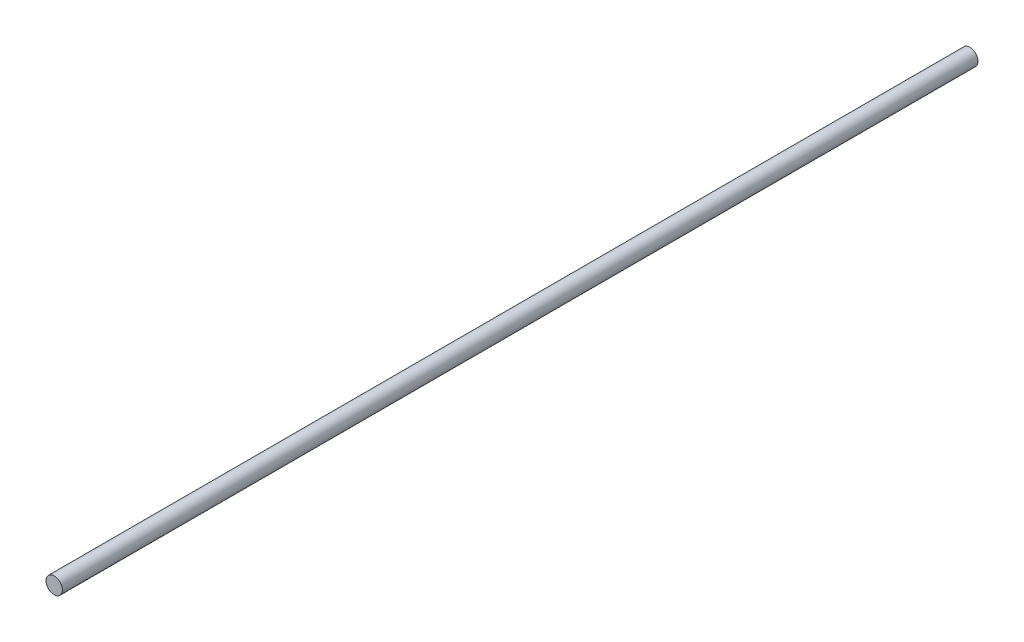
ISO-10303-21;
HEADER;
FILE_DESCRIPTION(('STEP AP214'),'2;1');
FILE_NAME('part.step','',(''),(''),'','','');
FILE_SCHEMA(('AUTOMOTIVE_DESIGN { 1 0 10303 214 1 1 1 1 }'));
ENDSEC;
DATA;
#1=APPLICATION_CONTEXT('core data for automotive mechanical design processes');
#2=APPLICATION_PROTOCOL_DEFINITION('international standard','automotive_design',2000,#1);
#3=PRODUCT_CONTEXT('',#1,'mechanical');
#4=PRODUCT('Part','Part','',(#3));
#5=PRODUCT_RELATED_PRODUCT_CATEGORY('part','',(#4));
#6=PRODUCT_DEFINITION_FORMATION('','',#4);
#7=PRODUCT_DEFINITION_CONTEXT('part definition',#1,'design');
#8=PRODUCT_DEFINITION('design','',#6,#7);
#9=PRODUCT_DEFINITION_SHAPE('','',#8);
#10=(LENGTH_UNIT() NAMED_UNIT(*) SI_UNIT(.MILLI.,.METRE.));
#11=(NAMED_UNIT(*) PLANE_ANGLE_UNIT() SI_UNIT($,.RADIAN.));
#12=(NAMED_UNIT(*) SI_UNIT($,.STERADIAN.) SOLID_ANGLE_UNIT());
#13=UNCERTAINTY_MEASURE_WITH_UNIT(LENGTH_MEASURE(1.E-05),#10,'distance_accuracy_value','');
#14=(GEOMETRIC_REPRESENTATION_CONTEXT(3) GLOBAL_UNCERTAINTY_ASSIGNED_CONTEXT((#13)) GLOBAL_UNIT_ASSIGNED_CONTEXT((#10,
#11,#12)) REPRESENTATION_CONTEXT('',''));
#15=CARTESIAN_POINT('',(0.,0.,0.));
#16=DIRECTION('',(0.,0.,1.));
#17=DIRECTION('',(1.,0.,0.));
#18=AXIS2_PLACEMENT_3D('',#15,#16,#17);
#19=CARTESIAN_POINT('',(0.,0.,177.8));
#20=DIRECTION('',(0.,0.,-1.));
#21=DIRECTION('',(-1.,0.,0.));
#22=AXIS2_PLACEMENT_3D('',#19,#20,#21);
#23=CYLINDRICAL_SURFACE('',#22,1.5875);
#24=CARTESIAN_POINT('',(0.,0.,177.8));
#25=DIRECTION('',(0.,0.,1.));
#26=DIRECTION('',(1.,0.,0.));
#27=AXIS2_PLACEMENT_3D('',#24,#25,#26);
#28=CIRCLE('',#27,1.5875);
#29=CARTESIAN_POINT('',(1.5875,0.,177.8));
#30=VERTEX_POINT('',#29);
#31=EDGE_CURVE('E10',#30,#30,#28,.T.);
#32=ORIENTED_EDGE('',*,*,#31,.F.);
#33=EDGE_LOOP('',(#32));
#34=FACE_BOUND('',#33,.T.);
#35=CARTESIAN_POINT('',(0.,0.,0.));
#36=DIRECTION('',(0.,0.,1.));
#37=DIRECTION('',(1.,0.,0.));
#38=AXIS2_PLACEMENT_3D('',#35,#36,#37);
#39=CIRCLE('',#38,1.5875);
#40=CARTESIAN_POINT('',(1.5875,0.,0.));
#41=VERTEX_POINT('',#40);
#42=EDGE_CURVE('E38',#41,#41,#39,.T.);
#43=ORIENTED_EDGE('',*,*,#42,.T.);
#44=EDGE_LOOP('',(#43));
#45=FACE_BOUND('',#44,.T.);
#46=ADVANCED_FACE('F35',(#34,#45),#23,.T.);
#47=CARTESIAN_POINT('',(0.,0.,177.8));
#48=DIRECTION('',(0.,0.,1.));
#49=DIRECTION('',(1.,0.,0.));
#50=AXIS2_PLACEMENT_3D('',#47,#48,#49);
#51=PLANE('',#50);
#52=ORIENTED_EDGE('',*,*,#31,.T.);
#53=EDGE_LOOP('',(#52));
#54=FACE_BOUND('',#53,.T.);
#55=ADVANCED_FACE('F50',(#54),#51,.T.);
#56=CARTESIAN_POINT('',(0.,0.,0.));
#57=DIRECTION('',(0.,0.,1.));
#58=DIRECTION('',(1.,0.,0.));
#59=AXIS2_PLACEMENT_3D('',#56,#57,#58);
#60=PLANE('',#59);
#61=ORIENTED_EDGE('',*,*,#42,.F.);
#62=EDGE_LOOP('',(#61));
#63=FACE_BOUND('',#62,.T.);
#64=ADVANCED_FACE('F48',(#63),#60,.F.);
#65=CLOSED_SHELL('',(#46,#55,#64));
#66=MANIFOLD_SOLID_BREP('B2',#65);
#67=ADVANCED_BREP_SHAPE_REPRESENTATION('',(#18,#66),#14);
#68=SHAPE_DEFINITION_REPRESENTATION(#9,#67);
ENDSEC;
END-ISO-10303-21;
